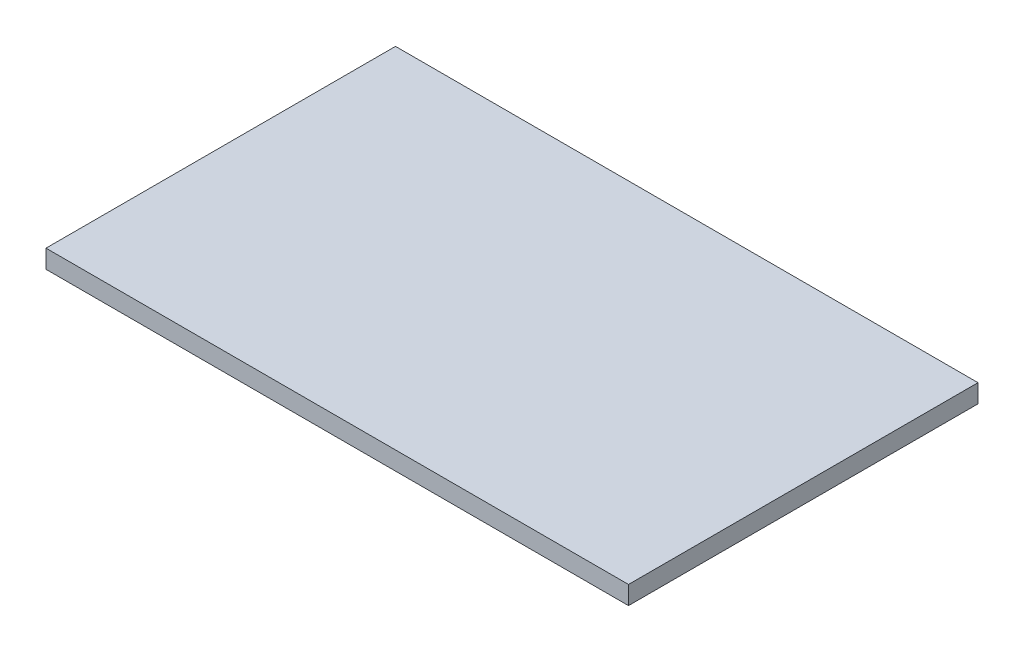
ISO-10303-21;
HEADER;
FILE_DESCRIPTION(('STEP AP214'),'2;1');
FILE_NAME('part.step','',(''),(''),'','','');
FILE_SCHEMA(('AUTOMOTIVE_DESIGN { 1 0 10303 214 1 1 1 1 }'));
ENDSEC;
DATA;
#1=APPLICATION_CONTEXT('core data for automotive mechanical design processes');
#2=APPLICATION_PROTOCOL_DEFINITION('international standard','automotive_design',2000,#1);
#3=PRODUCT_CONTEXT('',#1,'mechanical');
#4=PRODUCT('Part','Part','',(#3));
#5=PRODUCT_RELATED_PRODUCT_CATEGORY('part','',(#4));
#6=PRODUCT_DEFINITION_FORMATION('','',#4);
#7=PRODUCT_DEFINITION_CONTEXT('part definition',#1,'design');
#8=PRODUCT_DEFINITION('design','',#6,#7);
#9=PRODUCT_DEFINITION_SHAPE('','',#8);
#10=(LENGTH_UNIT() NAMED_UNIT(*) SI_UNIT(.MILLI.,.METRE.));
#11=(NAMED_UNIT(*) PLANE_ANGLE_UNIT() SI_UNIT($,.RADIAN.));
#12=(NAMED_UNIT(*) SI_UNIT($,.STERADIAN.) SOLID_ANGLE_UNIT());
#13=UNCERTAINTY_MEASURE_WITH_UNIT(LENGTH_MEASURE(1.E-05),#10,'distance_accuracy_value','');
#14=(GEOMETRIC_REPRESENTATION_CONTEXT(3) GLOBAL_UNCERTAINTY_ASSIGNED_CONTEXT((#13)) GLOBAL_UNIT_ASSIGNED_CONTEXT((#10,
#11,#12)) REPRESENTATION_CONTEXT('',''));
#15=CARTESIAN_POINT('',(0.,0.,0.));
#16=DIRECTION('',(0.,0.,1.));
#17=DIRECTION('',(1.,0.,0.));
#18=AXIS2_PLACEMENT_3D('',#15,#16,#17);
#19=CARTESIAN_POINT('',(25.4,0.8,15.24));
#20=DIRECTION('',(-1.,0.,0.));
#21=DIRECTION('',(0.,0.,1.));
#22=AXIS2_PLACEMENT_3D('',#19,#20,#21);
#23=PLANE('',#22);
#24=DIRECTION('',(0.,0.,-1.));
#25=VECTOR('',#24,1.);
#26=CARTESIAN_POINT('',(25.4,-0.8,15.24));
#27=LINE('',#26,#25);
#28=CARTESIAN_POINT('',(25.4,-0.8,15.24));
#29=VERTEX_POINT('',#28);
#30=CARTESIAN_POINT('',(25.4,-0.8,-15.24));
#31=VERTEX_POINT('',#30);
#32=EDGE_CURVE('E109',#29,#31,#27,.T.);
#33=ORIENTED_EDGE('',*,*,#32,.T.);
#34=DIRECTION('',(0.,-1.,0.));
#35=VECTOR('',#34,1.);
#36=CARTESIAN_POINT('',(25.4,0.8,-15.24));
#37=LINE('',#36,#35);
#38=CARTESIAN_POINT('',(25.4,0.8,-15.24));
#39=VERTEX_POINT('',#38);
#40=EDGE_CURVE('E11',#39,#31,#37,.T.);
#41=ORIENTED_EDGE('',*,*,#40,.F.);
#42=DIRECTION('',(0.,0.,-1.));
#43=VECTOR('',#42,1.);
#44=CARTESIAN_POINT('',(25.4,0.8,15.24));
#45=LINE('',#44,#43);
#46=CARTESIAN_POINT('',(25.4,0.8,15.24));
#47=VERTEX_POINT('',#46);
#48=EDGE_CURVE('E93',#47,#39,#45,.T.);
#49=ORIENTED_EDGE('',*,*,#48,.F.);
#50=DIRECTION('',(0.,-1.,0.));
#51=VECTOR('',#50,1.);
#52=CARTESIAN_POINT('',(25.4,0.8,15.24));
#53=LINE('',#52,#51);
#54=EDGE_CURVE('E105',#47,#29,#53,.T.);
#55=ORIENTED_EDGE('',*,*,#54,.T.);
#56=EDGE_LOOP('',(#33,#41,#49,#55));
#57=FACE_BOUND('',#56,.T.);
#58=ADVANCED_FACE('F41',(#57),#23,.F.);
#59=CARTESIAN_POINT('',(-25.4,0.8,-15.24));
#60=DIRECTION('',(0.,0.,1.));
#61=DIRECTION('',(1.,0.,0.));
#62=AXIS2_PLACEMENT_3D('',#59,#60,#61);
#63=PLANE('',#62);
#64=DIRECTION('',(-1.,0.,0.));
#65=VECTOR('',#64,1.);
#66=CARTESIAN_POINT('',(-25.4,-0.8,-15.24));
#67=LINE('',#66,#65);
#68=CARTESIAN_POINT('',(-25.4,-0.8,-15.24));
#69=VERTEX_POINT('',#68);
#70=EDGE_CURVE('E98',#31,#69,#67,.T.);
#71=ORIENTED_EDGE('',*,*,#70,.T.);
#72=DIRECTION('',(0.,-1.,0.));
#73=VECTOR('',#72,1.);
#74=CARTESIAN_POINT('',(-25.4,0.8,-15.24));
#75=LINE('',#74,#73);
#76=CARTESIAN_POINT('',(-25.4,0.8,-15.24));
#77=VERTEX_POINT('',#76);
#78=EDGE_CURVE('E50',#77,#69,#75,.T.);
#79=ORIENTED_EDGE('',*,*,#78,.F.);
#80=DIRECTION('',(-1.,0.,0.));
#81=VECTOR('',#80,1.);
#82=CARTESIAN_POINT('',(-25.4,0.8,-15.24));
#83=LINE('',#82,#81);
#84=EDGE_CURVE('E88',#39,#77,#83,.T.);
#85=ORIENTED_EDGE('',*,*,#84,.F.);
#86=ORIENTED_EDGE('',*,*,#40,.T.);
#87=EDGE_LOOP('',(#71,#79,#85,#86));
#88=FACE_BOUND('',#87,.T.);
#89=ADVANCED_FACE('F97',(#88),#63,.F.);
#90=CARTESIAN_POINT('',(-25.4,0.8,15.24));
#91=DIRECTION('',(1.,0.,0.));
#92=DIRECTION('',(0.,0.,-1.));
#93=AXIS2_PLACEMENT_3D('',#90,#91,#92);
#94=PLANE('',#93);
#95=DIRECTION('',(0.,0.,1.));
#96=VECTOR('',#95,1.);
#97=CARTESIAN_POINT('',(-25.4,-0.8,15.24));
#98=LINE('',#97,#96);
#99=CARTESIAN_POINT('',(-25.4,-0.8,15.24));
#100=VERTEX_POINT('',#99);
#101=EDGE_CURVE('E75',#69,#100,#98,.T.);
#102=ORIENTED_EDGE('',*,*,#101,.T.);
#103=DIRECTION('',(0.,-1.,0.));
#104=VECTOR('',#103,1.);
#105=CARTESIAN_POINT('',(-25.4,0.8,15.24));
#106=LINE('',#105,#104);
#107=CARTESIAN_POINT('',(-25.4,0.8,15.24));
#108=VERTEX_POINT('',#107);
#109=EDGE_CURVE('E100',#108,#100,#106,.T.);
#110=ORIENTED_EDGE('',*,*,#109,.F.);
#111=DIRECTION('',(0.,0.,1.));
#112=VECTOR('',#111,1.);
#113=CARTESIAN_POINT('',(-25.4,0.8,15.24));
#114=LINE('',#113,#112);
#115=EDGE_CURVE('E91',#77,#108,#114,.T.);
#116=ORIENTED_EDGE('',*,*,#115,.F.);
#117=ORIENTED_EDGE('',*,*,#78,.T.);
#118=EDGE_LOOP('',(#102,#110,#116,#117));
#119=FACE_BOUND('',#118,.T.);
#120=ADVANCED_FACE('F101',(#119),#94,.F.);
#121=CARTESIAN_POINT('',(-25.4,0.8,15.24));
#122=DIRECTION('',(0.,0.,-1.));
#123=DIRECTION('',(-1.,0.,0.));
#124=AXIS2_PLACEMENT_3D('',#121,#122,#123);
#125=PLANE('',#124);
#126=DIRECTION('',(1.,0.,0.));
#127=VECTOR('',#126,1.);
#128=CARTESIAN_POINT('',(-25.4,-0.8,15.24));
#129=LINE('',#128,#127);
#130=EDGE_CURVE('E81',#100,#29,#129,.T.);
#131=ORIENTED_EDGE('',*,*,#130,.T.);
#132=ORIENTED_EDGE('',*,*,#54,.F.);
#133=DIRECTION('',(1.,0.,0.));
#134=VECTOR('',#133,1.);
#135=CARTESIAN_POINT('',(-25.4,0.8,15.24));
#136=LINE('',#135,#134);
#137=EDGE_CURVE('E58',#108,#47,#136,.T.);
#138=ORIENTED_EDGE('',*,*,#137,.F.);
#139=ORIENTED_EDGE('',*,*,#109,.T.);
#140=EDGE_LOOP('',(#131,#132,#138,#139));
#141=FACE_BOUND('',#140,.T.);
#142=ADVANCED_FACE('F122',(#141),#125,.F.);
#143=CARTESIAN_POINT('',(0.,0.8,0.));
#144=DIRECTION('',(0.,-1.,0.));
#145=DIRECTION('',(0.,0.,-1.));
#146=AXIS2_PLACEMENT_3D('',#143,#144,#145);
#147=PLANE('',#146);
#148=ORIENTED_EDGE('',*,*,#48,.T.);
#149=ORIENTED_EDGE('',*,*,#84,.T.);
#150=ORIENTED_EDGE('',*,*,#115,.T.);
#151=ORIENTED_EDGE('',*,*,#137,.T.);
#152=EDGE_LOOP('',(#148,#149,#150,#151));
#153=FACE_BOUND('',#152,.T.);
#154=ADVANCED_FACE('F89',(#153),#147,.F.);
#155=CARTESIAN_POINT('',(0.,-0.8,0.));
#156=DIRECTION('',(0.,-1.,0.));
#157=DIRECTION('',(0.,0.,-1.));
#158=AXIS2_PLACEMENT_3D('',#155,#156,#157);
#159=PLANE('',#158);
#160=ORIENTED_EDGE('',*,*,#32,.F.);
#161=ORIENTED_EDGE('',*,*,#130,.F.);
#162=ORIENTED_EDGE('',*,*,#101,.F.);
#163=ORIENTED_EDGE('',*,*,#70,.F.);
#164=EDGE_LOOP('',(#160,#161,#162,#163));
#165=FACE_BOUND('',#164,.T.);
#166=ADVANCED_FACE('F125',(#165),#159,.T.);
#167=CLOSED_SHELL('',(#58,#89,#120,#142,#154,#166));
#168=MANIFOLD_SOLID_BREP('B2',#167);
#169=ADVANCED_BREP_SHAPE_REPRESENTATION('',(#18,#168),#14);
#170=SHAPE_DEFINITION_REPRESENTATION(#9,#169);
ENDSEC;
END-ISO-10303-21;
